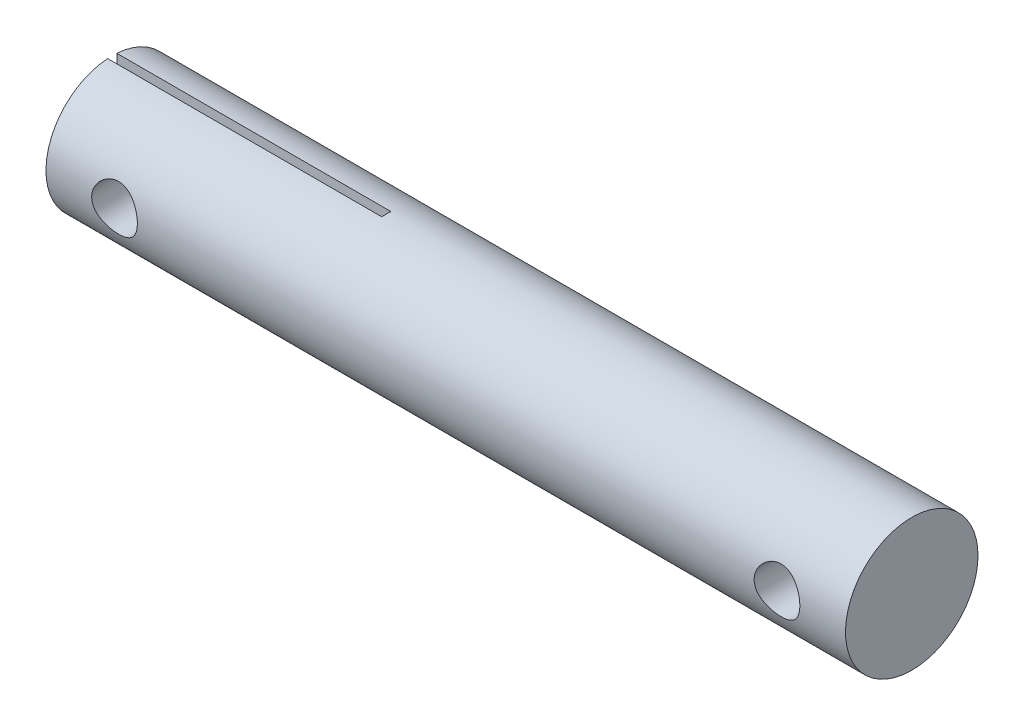
ISO-10303-21;
HEADER;
FILE_DESCRIPTION(('STEP AP214'),'2;1');
FILE_NAME('part.step','',(''),(''),'','','');
FILE_SCHEMA(('AUTOMOTIVE_DESIGN { 1 0 10303 214 1 1 1 1 }'));
ENDSEC;
DATA;
#1=APPLICATION_CONTEXT('core data for automotive mechanical design processes');
#2=APPLICATION_PROTOCOL_DEFINITION('international standard','automotive_design',2000,#1);
#3=PRODUCT_CONTEXT('',#1,'mechanical');
#4=PRODUCT('Part','Part','',(#3));
#5=PRODUCT_RELATED_PRODUCT_CATEGORY('part','',(#4));
#6=PRODUCT_DEFINITION_FORMATION('','',#4);
#7=PRODUCT_DEFINITION_CONTEXT('part definition',#1,'design');
#8=PRODUCT_DEFINITION('design','',#6,#7);
#9=PRODUCT_DEFINITION_SHAPE('','',#8);
#10=(LENGTH_UNIT() NAMED_UNIT(*) SI_UNIT(.MILLI.,.METRE.));
#11=(NAMED_UNIT(*) PLANE_ANGLE_UNIT() SI_UNIT($,.RADIAN.));
#12=(NAMED_UNIT(*) SI_UNIT($,.STERADIAN.) SOLID_ANGLE_UNIT());
#13=UNCERTAINTY_MEASURE_WITH_UNIT(LENGTH_MEASURE(1.E-05),#10,'distance_accuracy_value','');
#14=(GEOMETRIC_REPRESENTATION_CONTEXT(3) GLOBAL_UNCERTAINTY_ASSIGNED_CONTEXT((#13)) GLOBAL_UNIT_ASSIGNED_CONTEXT((#10,
#11,#12)) REPRESENTATION_CONTEXT('',''));
#15=CARTESIAN_POINT('',(0.,0.,0.));
#16=DIRECTION('',(0.,0.,1.));
#17=DIRECTION('',(1.,0.,0.));
#18=AXIS2_PLACEMENT_3D('',#15,#16,#17);
#19=CARTESIAN_POINT('',(35.,0.,0.));
#20=DIRECTION('',(-1.,0.,0.));
#21=DIRECTION('',(0.,0.,1.));
#22=AXIS2_PLACEMENT_3D('',#19,#20,#21);
#23=CYLINDRICAL_SURFACE('',#22,2.9);
#24=CARTESIAN_POINT('',(0.,0.,0.));
#25=DIRECTION('',(1.,0.,0.));
#26=DIRECTION('',(0.,0.,-1.));
#27=AXIS2_PLACEMENT_3D('',#24,#25,#26);
#28=CIRCLE('',#27,2.9);
#29=CARTESIAN_POINT('',(0.,2.89309522829789,0.2));
#30=VERTEX_POINT('',#29);
#31=CARTESIAN_POINT('',(0.,2.89309522829789,-0.2));
#32=VERTEX_POINT('',#31);
#33=EDGE_CURVE('E111',#30,#32,#28,.T.);
#34=ORIENTED_EDGE('',*,*,#33,.T.);
#35=DIRECTION('',(-1.,0.,0.));
#36=VECTOR('',#35,1.);
#37=CARTESIAN_POINT('',(35.,2.89309522829789,-0.2));
#38=LINE('',#37,#36);
#39=CARTESIAN_POINT('',(12.,2.89309522829789,-0.2));
#40=VERTEX_POINT('',#39);
#41=EDGE_CURVE('E109',#32,#40,#38,.F.);
#42=ORIENTED_EDGE('',*,*,#41,.T.);
#43=CARTESIAN_POINT('',(12.,0.,0.));
#44=DIRECTION('',(-1.,0.,0.));
#45=DIRECTION('',(0.,0.,1.));
#46=AXIS2_PLACEMENT_3D('',#43,#44,#45);
#47=CIRCLE('',#46,2.9);
#48=CARTESIAN_POINT('',(12.,2.89309522829789,0.2));
#49=VERTEX_POINT('',#48);
#50=EDGE_CURVE('E11',#49,#40,#47,.T.);
#51=ORIENTED_EDGE('',*,*,#50,.F.);
#52=DIRECTION('',(-1.,0.,0.));
#53=VECTOR('',#52,1.);
#54=CARTESIAN_POINT('',(35.,2.89309522829789,0.2));
#55=LINE('',#54,#53);
#56=EDGE_CURVE('E105',#49,#30,#55,.T.);
#57=ORIENTED_EDGE('',*,*,#56,.T.);
#58=EDGE_LOOP('',(#34,#42,#51,#57));
#59=FACE_BOUND('',#58,.T.);
#60=CARTESIAN_POINT('',(35.,0.,0.));
#61=DIRECTION('',(1.,0.,0.));
#62=DIRECTION('',(0.,0.,-1.));
#63=AXIS2_PLACEMENT_3D('',#60,#61,#62);
#64=CIRCLE('',#63,2.9);
#65=CARTESIAN_POINT('',(35.,0.,-2.9));
#66=VERTEX_POINT('',#65);
#67=EDGE_CURVE('E112',#66,#66,#64,.T.);
#68=ORIENTED_EDGE('',*,*,#67,.F.);
#69=EDGE_LOOP('',(#68));
#70=FACE_BOUND('',#69,.T.);
#71=CARTESIAN_POINT('',(32.,-1.00345238585106,-2.72086076625207));
#72=CARTESIAN_POINT('',(31.945668932359,-1.00345305999284,-2.72086021317153));
#73=CARTESIAN_POINT('',(31.8913425304579,-0.99900963956225,-2.72251153528407));
#74=CARTESIAN_POINT('',(31.7843073470255,-0.981419137113376,-2.72890129793882));
#75=CARTESIAN_POINT('',(31.7315987427294,-0.968271105011568,-2.73364007546708));
#76=CARTESIAN_POINT('',(31.6293691768065,-0.93379540289949,-2.74560649818595));
#77=CARTESIAN_POINT('',(31.5798418181211,-0.912484788995946,-2.75282895042417));
#78=CARTESIAN_POINT('',(31.4850485391322,-0.862348136474107,-2.76894323666809));
#79=CARTESIAN_POINT('',(31.4397836653777,-0.833520258689757,-2.77783547905372));
#80=CARTESIAN_POINT('',(31.3528910509856,-0.767865567456136,-2.79671067974953));
#81=CARTESIAN_POINT('',(31.3114690637809,-0.730774639190834,-2.80672237157249));
#82=CARTESIAN_POINT('',(31.2352915572014,-0.650209936416537,-2.82647224615793));
#83=CARTESIAN_POINT('',(31.2005372108595,-0.606735041151965,-2.83621038053691));
#84=CARTESIAN_POINT('',(31.1377241490165,-0.513105991243305,-2.8546557797525));
#85=CARTESIAN_POINT('',(31.1098848849623,-0.462796598211762,-2.86332568248111));
#86=CARTESIAN_POINT('',(31.0631473899614,-0.357858093927535,-2.87832267666306));
#87=CARTESIAN_POINT('',(31.044246576938,-0.303230235491408,-2.8846504445809));
#88=CARTESIAN_POINT('',(31.0166233804261,-0.193347112050211,-2.8940531545862));
#89=CARTESIAN_POINT('',(31.0075506312218,-0.13818965474278,-2.8972396740321));
#90=CARTESIAN_POINT('',(30.9987266279835,-0.0270490486292474,-2.9004060699528));
#91=CARTESIAN_POINT('',(30.9989727854618,0.0289338665728227,-2.90038683687585));
#92=CARTESIAN_POINT('',(31.0085625239348,0.13762558202393,-2.89722155986127));
#93=CARTESIAN_POINT('',(31.0175215551512,0.190372821437222,-2.89420757026013));
#94=CARTESIAN_POINT('',(31.0436454923048,0.293565337173212,-2.88556784571808));
#95=CARTESIAN_POINT('',(31.0608109506516,0.34401045828003,-2.87994193495832));
#96=CARTESIAN_POINT('',(31.1030638037487,0.441955880220831,-2.86655764298503));
#97=CARTESIAN_POINT('',(31.1282530340935,0.489408372673723,-2.85877202516899));
#98=CARTESIAN_POINT('',(31.1857528086158,0.579523136222241,-2.84187578287272));
#99=CARTESIAN_POINT('',(31.2180654169426,0.622184013426221,-2.83276477459341));
#100=CARTESIAN_POINT('',(31.2907892251231,0.703762509714336,-2.81363851749344));
#101=CARTESIAN_POINT('',(31.3315245519862,0.742386348329864,-2.80360083413692));
#102=CARTESIAN_POINT('',(31.4189710079291,0.81235501606704,-2.7841338849641));
#103=CARTESIAN_POINT('',(31.4656831967856,0.843698551512894,-2.77470472749465));
#104=CARTESIAN_POINT('',(31.5647592401226,0.898670505204048,-2.75739707918534));
#105=CARTESIAN_POINT('',(31.6172031288642,0.922164154932909,-2.74954651501986));
#106=CARTESIAN_POINT('',(31.7256409113218,0.959884764577872,-2.73660804649032));
#107=CARTESIAN_POINT('',(31.7816331940916,0.974115897005449,-2.73151889835572));
#108=CARTESIAN_POINT('',(31.8927329312364,0.992293807321215,-2.72496651191048));
#109=CARTESIAN_POINT('',(31.9477562983551,0.996696547696072,-2.72334267843518));
#110=CARTESIAN_POINT('',(32.0577679839026,0.996391051294899,-2.72345471292078));
#111=CARTESIAN_POINT('',(32.1127563071081,0.991684614395714,-2.72518991717145));
#112=CARTESIAN_POINT('',(32.2189869483547,0.973706350635807,-2.73166254207127));
#113=CARTESIAN_POINT('',(32.2702924338232,0.960761879390611,-2.7362851027711));
#114=CARTESIAN_POINT('',(32.3699899499211,0.927073032755896,-2.7478811371546));
#115=CARTESIAN_POINT('',(32.4183814415743,0.90632721952944,-2.75485504418183));
#116=CARTESIAN_POINT('',(32.5126560120335,0.856844928483978,-2.77065167629178));
#117=CARTESIAN_POINT('',(32.558402842708,0.827866455685997,-2.77952800547223));
#118=CARTESIAN_POINT('',(32.6445495608127,0.763010208204303,-2.79802624699304));
#119=CARTESIAN_POINT('',(32.6849477695597,0.727130276099429,-2.80764839191506));
#120=CARTESIAN_POINT('',(32.7614090763962,0.647290220975024,-2.82715171540382));
#121=CARTESIAN_POINT('',(32.797140499569,0.603008476243459,-2.83702060425689));
#122=CARTESIAN_POINT('',(32.8606915134477,0.508832932689618,-2.85541373280247));
#123=CARTESIAN_POINT('',(32.8885113395954,0.458939300933455,-2.86393801250591));
#124=CARTESIAN_POINT('',(32.9352022099163,0.355172999359483,-2.87864166119301));
#125=CARTESIAN_POINT('',(32.9541280723282,0.301327134155518,-2.88483534639934));
#126=CARTESIAN_POINT('',(32.9825720117828,0.190960227968754,-2.89423492121065));
#127=CARTESIAN_POINT('',(32.9920937399522,0.134440234146482,-2.89744197034039));
#128=CARTESIAN_POINT('',(33.001114241551,0.0233667148665718,-2.90041149574827));
#129=CARTESIAN_POINT('',(33.0010896475362,-0.0311441224823618,-2.90033793823468));
#130=CARTESIAN_POINT('',(32.9922090935117,-0.139345884020661,-2.89715575799774));
#131=CARTESIAN_POINT('',(32.9833539197338,-0.193036880772543,-2.89404740547828));
#132=CARTESIAN_POINT('',(32.9573834204143,-0.297127069654994,-2.88520341500109));
#133=CARTESIAN_POINT('',(32.9404166532676,-0.347567637508001,-2.87951511954888));
#134=CARTESIAN_POINT('',(32.8988467648995,-0.444900676590368,-2.86609137345669));
#135=CARTESIAN_POINT('',(32.8742422244528,-0.491792486385586,-2.8583555423899));
#136=CARTESIAN_POINT('',(32.8170001214792,-0.582681258921846,-2.84125053015508));
#137=CARTESIAN_POINT('',(32.7840880832711,-0.626495484694053,-2.83182964865602));
#138=CARTESIAN_POINT('',(32.7116225365943,-0.708132805944206,-2.81252747399333));
#139=CARTESIAN_POINT('',(32.6720668261353,-0.745953906946411,-2.80264602896683));
#140=CARTESIAN_POINT('',(32.585417997114,-0.816179871818549,-2.78302676539399));
#141=CARTESIAN_POINT('',(32.5380750419355,-0.848284273074713,-2.77331312276287));
#142=CARTESIAN_POINT('',(32.4383578487793,-0.904065659755598,-2.75563521416128));
#143=CARTESIAN_POINT('',(32.3859844955296,-0.927744123669304,-2.74767064137764));
#144=CARTESIAN_POINT('',(32.2788460164568,-0.965427356382385,-2.7346556717468));
#145=CARTESIAN_POINT('',(32.2241606689957,-0.979636796504087,-2.72954403479918));
#146=CARTESIAN_POINT('',(32.1129813570893,-0.998646999275911,-2.72264756313134));
#147=CARTESIAN_POINT('',(32.056488156755,-1.00345168494404,-2.72086134129139));
#148=CARTESIAN_POINT('',(32.,-1.00345238585106,-2.72086076625207));
#149=B_SPLINE_CURVE_WITH_KNOTS('',3,(#71,#72,#73,#74,#75,#76,#77,#78,#79,#80,#81,#82,#83,#84,
#85,#86,#87,#88,#89,#90,#91,#92,#93,#94,#95,#96,#97,#98,#99,#100,#101,#102,#103,#104,#105,#106,
#107,#108,#109,#110,#111,#112,#113,#114,#115,#116,#117,#118,#119,#120,#121,#122,#123,#124,#125,
#126,#127,#128,#129,#130,#131,#132,#133,#134,#135,#136,#137,#138,#139,#140,#141,#142,#143,#144,
#145,#146,#147,#148),.UNSPECIFIED.,.T.,.F.,(4,2,2,2,2,2,2,2,2,2,2,2,2,2,2,2,2,2,2,2,2,2,2,2,2,2,
2,2,2,2,2,2,2,2,2,2,2,2,4),(0.,0.162783640432791,0.32558505116519,0.488048120137136,
0.650550974510748,0.819278892298356,0.988036467090618,1.1616113480098,1.33513605716309,
1.50224748559135,1.66931249626559,1.82932369651847,1.98934566932663,2.15148543774813,
2.31367225149578,2.48396770465967,2.65429339541776,2.82740873434802,3.00044603546556,
3.16527249789327,3.33006639568444,3.48868911362301,3.64734108107733,3.81125002275815,
3.97521028648539,4.14763900612138,4.32006259390509,4.49140903416606,4.66268892350997,
4.82541824017966,4.98813306951629,5.14797582779596,5.30784830531739,5.47391952994901,
5.64004590653314,5.81327030678005,5.98646429654651,6.15578152671846,6.32502811430031),.UNSPECIFIED.);
#150=CARTESIAN_POINT('',(32.,-1.00345238585106,-2.72086076625207));
#151=VERTEX_POINT('',#150);
#152=EDGE_CURVE('E121',#151,#151,#149,.T.);
#153=ORIENTED_EDGE('',*,*,#152,.F.);
#154=EDGE_LOOP('',(#153));
#155=FACE_BOUND('',#154,.T.);
#156=CARTESIAN_POINT('',(32.9999940404982,0.,2.9));
#157=CARTESIAN_POINT('',(32.9998066534307,0.0544645815206822,2.90000044547209));
#158=CARTESIAN_POINT('',(32.9951540273774,0.108909158166563,2.89845171840446));
#159=CARTESIAN_POINT('',(32.9771022915649,0.216157473174875,2.89243177943249));
#160=CARTESIAN_POINT('',(32.9637028451294,0.268961148294963,2.88796045503368));
#161=CARTESIAN_POINT('',(32.9286738510098,0.371366993483789,2.87658461533888));
#162=CARTESIAN_POINT('',(32.9070586724938,0.420974577301274,2.86968434976551));
#163=CARTESIAN_POINT('',(32.8562767609551,0.515862220429735,2.85415499250082));
#164=CARTESIAN_POINT('',(32.8271083835114,0.561141334438723,2.84552552443424));
#165=CARTESIAN_POINT('',(32.7609226261194,0.6477502051607,2.82709145927908));
#166=CARTESIAN_POINT('',(32.7236771707835,0.688899359123849,2.81725739643333));
#167=CARTESIAN_POINT('',(32.6428854967667,0.764506273208072,2.79768802354975));
#168=CARTESIAN_POINT('',(32.5993377858124,0.798962443999024,2.78795273748656));
#169=CARTESIAN_POINT('',(32.505543985335,0.861237782008968,2.76936103341232));
#170=CARTESIAN_POINT('',(32.4551335122686,0.888821182355332,2.76054069383681));
#171=CARTESIAN_POINT('',(32.3500356479676,0.935039630398494,2.74523188932798));
#172=CARTESIAN_POINT('',(32.2953496859037,0.953677653526569,2.73874264920008));
#173=CARTESIAN_POINT('',(32.1853235578271,0.980797899806466,2.72914583302455));
#174=CARTESIAN_POINT('',(32.1300776488503,0.989621255546707,2.72592503337929));
#175=CARTESIAN_POINT('',(32.0188030109952,0.997924912373515,2.72289687865501));
#176=CARTESIAN_POINT('',(31.9627745443853,0.997408272016872,2.72308840614522));
#177=CARTESIAN_POINT('',(31.8544191705704,0.98731668940651,2.72676179672425));
#178=CARTESIAN_POINT('',(31.8020447524896,0.978183450876784,2.73008320631409));
#179=CARTESIAN_POINT('',(31.6996214351159,0.951832893957073,2.73938083645186));
#180=CARTESIAN_POINT('',(31.6495728392984,0.93461452384829,2.74535740237868));
#181=CARTESIAN_POINT('',(31.5521959949833,0.892282191854265,2.75940857278499));
#182=CARTESIAN_POINT('',(31.5049310798549,0.867034678862539,2.76751823130883));
#183=CARTESIAN_POINT('',(31.4151687197975,0.809454608585571,2.78490319254488));
#184=CARTESIAN_POINT('',(31.3726727322301,0.777119894351839,2.79417884975467));
#185=CARTESIAN_POINT('',(31.2911690999109,0.704158799925792,2.8134781728678));
#186=CARTESIAN_POINT('',(31.2524872607743,0.663171085198727,2.8235147369521));
#187=CARTESIAN_POINT('',(31.1824612227271,0.575160566726665,2.8427481160544));
#188=CARTESIAN_POINT('',(31.1511177678669,0.528137151760102,2.85194484586265));
#189=CARTESIAN_POINT('',(31.0964071278608,0.428717022858946,2.86858225182407));
#190=CARTESIAN_POINT('',(31.0731242510466,0.376270552797057,2.87600412946802));
#191=CARTESIAN_POINT('',(31.035813417151,0.26788785173058,2.88811418602225));
#192=CARTESIAN_POINT('',(31.0217819945176,0.211952936085916,2.8928033885035));
#193=CARTESIAN_POINT('',(31.003952897255,0.100961462789689,2.89875006472955));
#194=CARTESIAN_POINT('',(30.9997117901351,0.0459839946263809,2.9001562709705));
#195=CARTESIAN_POINT('',(31.0003185506263,-0.0639052332866257,2.89981604187808));
#196=CARTESIAN_POINT('',(31.0051648190918,-0.118817002896071,2.89807016123339));
#197=CARTESIAN_POINT('',(31.0234621762833,-0.225268981602776,2.89171457884867));
#198=CARTESIAN_POINT('',(31.0366460923986,-0.276860942125068,2.88719392029373));
#199=CARTESIAN_POINT('',(31.0709085491309,-0.377075950510625,2.87582321844246));
#200=CARTESIAN_POINT('',(31.0919881389462,-0.42569860280517,2.86897286558128));
#201=CARTESIAN_POINT('',(31.1421004898323,-0.520120040805736,2.85338931812693));
#202=CARTESIAN_POINT('',(31.1713404581055,-0.565800780840769,2.84460854341361));
#203=CARTESIAN_POINT('',(31.2366983655992,-0.651748288075916,2.82615633153855));
#204=CARTESIAN_POINT('',(31.2728185483872,-0.692013281929065,2.81648460437907));
#205=CARTESIAN_POINT('',(31.3529909816864,-0.768028568002402,2.79673919728646));
#206=CARTESIAN_POINT('',(31.3973438862432,-0.803463444220475,2.78666888404577));
#207=CARTESIAN_POINT('',(31.4915873227375,-0.866428441564638,2.7677402735469));
#208=CARTESIAN_POINT('',(31.5414779477942,-0.893958429738783,2.75888199667523));
#209=CARTESIAN_POINT('',(31.6454318169645,-0.940207758493913,2.7434660823836));
#210=CARTESIAN_POINT('',(31.6994877009546,-0.958942243405091,2.73690449545739));
#211=CARTESIAN_POINT('',(31.8102691618955,-0.98694722910158,2.72693244905969));
#212=CARTESIAN_POINT('',(31.8669933976262,-0.996222432433083,2.72352042390886));
#213=CARTESIAN_POINT('',(31.9781149136589,-1.0046779545737,2.72041177966843));
#214=CARTESIAN_POINT('',(32.0324667549055,-1.00438965020842,2.72051958296488));
#215=CARTESIAN_POINT('',(32.1403016547198,-0.995038917259364,2.72395333951936));
#216=CARTESIAN_POINT('',(32.1937847673116,-0.985977036420875,2.72727909187683));
#217=CARTESIAN_POINT('',(32.2972387928766,-0.959715262773382,2.73662809198885));
#218=CARTESIAN_POINT('',(32.347259989615,-0.942691032115902,2.7425929700232));
#219=CARTESIAN_POINT('',(32.4437750227589,-0.901130615751719,2.75652711698348));
#220=CARTESIAN_POINT('',(32.4902680309059,-0.876592672931815,2.76449685467639));
#221=CARTESIAN_POINT('',(32.5807694389694,-0.81936057432578,2.78201053480927));
#222=CARTESIAN_POINT('',(32.6245591665344,-0.786337970636084,2.79161076236934));
#223=CARTESIAN_POINT('',(32.706145443988,-0.713625822124459,2.81107686227833));
#224=CARTESIAN_POINT('',(32.7439402344713,-0.673934327115974,2.82094281162167));
#225=CARTESIAN_POINT('',(32.8140938419515,-0.58697807802039,2.84033823368347));
#226=CARTESIAN_POINT('',(32.8461516801831,-0.539462338137373,2.84983535691801));
#227=CARTESIAN_POINT('',(32.9017928586473,-0.439394021766618,2.86696796562436));
#228=CARTESIAN_POINT('',(32.9253777064506,-0.386842343416352,2.8746037821944));
#229=CARTESIAN_POINT('',(32.9628203541613,-0.279387678342412,2.8870052949059));
#230=CARTESIAN_POINT('',(32.976884305494,-0.224563783257892,2.89183147940451));
#231=CARTESIAN_POINT('',(32.99556692245,-0.113152346944582,2.89832808821211));
#232=CARTESIAN_POINT('',(33.0001886554431,-0.0565653845270845,2.8999995373452));
#233=CARTESIAN_POINT('',(32.9999940404982,0.,2.9));
#234=B_SPLINE_CURVE_WITH_KNOTS('',3,(#156,#157,#158,#159,#160,#161,#162,#163,#164,#165,#166,
#167,#168,#169,#170,#171,#172,#173,#174,#175,#176,#177,#178,#179,#180,#181,#182,#183,#184,#185,
#186,#187,#188,#189,#190,#191,#192,#193,#194,#195,#196,#197,#198,#199,#200,#201,#202,#203,#204,
#205,#206,#207,#208,#209,#210,#211,#212,#213,#214,#215,#216,#217,#218,#219,#220,#221,#222,#223,
#224,#225,#226,#227,#228,#229,#230,#231,#232,#233),.UNSPECIFIED.,.T.,.F.,(4,2,2,2,2,2,2,2,2,2,2,
2,2,2,2,2,2,2,2,2,2,2,2,2,2,2,2,2,2,2,2,2,2,2,2,2,2,2,4),(0.,0.163186329623233,
0.326378940865445,0.489287434816883,0.652231425742869,0.820575212375441,0.988958925545895,
1.16250309549465,1.33598950072153,1.50323671978019,1.67042917159445,1.82949148194305,
1.98857448894733,2.15045566021257,2.31238616765092,2.48332953743942,2.6542902319502,
2.82698856165705,2.99962216255689,3.16426883704889,3.32888654065695,3.48847938434288,
3.64809344267939,3.812201329649,3.97636282241749,4.14852002962219,4.32068013216137,
4.49254270776626,4.66431980264654,4.82656931927433,4.98880870711639,5.14762644984913,
5.30648136118026,5.47278373043323,5.63913481646782,5.81258816901449,5.98601064428797,
6.15554646618414,6.32502720443596),.UNSPECIFIED.);
#235=CARTESIAN_POINT('',(32.9999940404982,0.,2.9));
#236=VERTEX_POINT('',#235);
#237=EDGE_CURVE('E41',#236,#236,#234,.T.);
#238=ORIENTED_EDGE('',*,*,#237,.F.);
#239=EDGE_LOOP('',(#238));
#240=FACE_BOUND('',#239,.T.);
#241=CARTESIAN_POINT('',(3.,-1.00345238585106,-2.72086076625207));
#242=CARTESIAN_POINT('',(2.94566893235899,-1.00345305999284,-2.72086021317153));
#243=CARTESIAN_POINT('',(2.89134253045788,-0.999009639562248,-2.72251153528407));
#244=CARTESIAN_POINT('',(2.7843073470255,-0.981419137113374,-2.72890129793882));
#245=CARTESIAN_POINT('',(2.7315987427294,-0.968271105011566,-2.73364007546708));
#246=CARTESIAN_POINT('',(2.62936917680646,-0.933795402899488,-2.74560649818595));
#247=CARTESIAN_POINT('',(2.57984181812114,-0.912484788995944,-2.75282895042417));
#248=CARTESIAN_POINT('',(2.48504853913221,-0.862348136474104,-2.76894323666809));
#249=CARTESIAN_POINT('',(2.43978366537773,-0.833520258689754,-2.77783547905372));
#250=CARTESIAN_POINT('',(2.35289105098564,-0.767865567456131,-2.79671067974953));
#251=CARTESIAN_POINT('',(2.31146906378093,-0.730774639190829,-2.80672237157249));
#252=CARTESIAN_POINT('',(2.23529155720145,-0.650209936416532,-2.82647224615793));
#253=CARTESIAN_POINT('',(2.20053721085951,-0.606735041151961,-2.83621038053691));
#254=CARTESIAN_POINT('',(2.1377241490165,-0.513105991243302,-2.8546557797525));
#255=CARTESIAN_POINT('',(2.10988488496225,-0.462796598211759,-2.86332568248111));
#256=CARTESIAN_POINT('',(2.06314738996144,-0.357858093927532,-2.87832267666306));
#257=CARTESIAN_POINT('',(2.04424657693797,-0.303230235491405,-2.8846504445809));
#258=CARTESIAN_POINT('',(2.01662338042609,-0.193347112050209,-2.8940531545862));
#259=CARTESIAN_POINT('',(2.00755063122176,-0.138189654742778,-2.8972396740321));
#260=CARTESIAN_POINT('',(1.9987266279835,-0.027049048629246,-2.9004060699528));
#261=CARTESIAN_POINT('',(1.99897278546178,0.0289338665728237,-2.90038683687585));
#262=CARTESIAN_POINT('',(2.00856252393479,0.137625582023931,-2.89722155986127));
#263=CARTESIAN_POINT('',(2.01752155515124,0.190372821437223,-2.89420757026013));
#264=CARTESIAN_POINT('',(2.04364549230479,0.293565337173213,-2.88556784571808));
#265=CARTESIAN_POINT('',(2.0608109506516,0.344010458280031,-2.87994193495832));
#266=CARTESIAN_POINT('',(2.10306380374873,0.441955880220833,-2.86655764298503));
#267=CARTESIAN_POINT('',(2.12825303409353,0.489408372673726,-2.85877202516899));
#268=CARTESIAN_POINT('',(2.18575280861581,0.579523136222244,-2.84187578287272));
#269=CARTESIAN_POINT('',(2.21806541694259,0.622184013426224,-2.83276477459341));
#270=CARTESIAN_POINT('',(2.29078922512315,0.703762509714338,-2.81363851749344));
#271=CARTESIAN_POINT('',(2.33152455198626,0.742386348329868,-2.80360083413691));
#272=CARTESIAN_POINT('',(2.41897100792909,0.812355016067043,-2.7841338849641));
#273=CARTESIAN_POINT('',(2.46568319678563,0.843698551512895,-2.77470472749465));
#274=CARTESIAN_POINT('',(2.56475924012264,0.898670505204048,-2.75739707918534));
#275=CARTESIAN_POINT('',(2.61720312886419,0.922164154932908,-2.74954651501986));
#276=CARTESIAN_POINT('',(2.7256409113218,0.959884764577871,-2.73660804649032));
#277=CARTESIAN_POINT('',(2.7816331940916,0.974115897005448,-2.73151889835572));
#278=CARTESIAN_POINT('',(2.89273293123637,0.992293807321214,-2.72496651191048));
#279=CARTESIAN_POINT('',(2.94775629835506,0.996696547696071,-2.72334267843518));
#280=CARTESIAN_POINT('',(3.05776798390255,0.996391051294897,-2.72345471292078));
#281=CARTESIAN_POINT('',(3.11275630710812,0.991684614395713,-2.72518991717145));
#282=CARTESIAN_POINT('',(3.21898694835471,0.973706350635806,-2.73166254207127));
#283=CARTESIAN_POINT('',(3.27029243382318,0.96076187939061,-2.7362851027711));
#284=CARTESIAN_POINT('',(3.36998994992106,0.927073032755894,-2.7478811371546));
#285=CARTESIAN_POINT('',(3.41838144157433,0.906327219529437,-2.75485504418184));
#286=CARTESIAN_POINT('',(3.51265601203353,0.856844928483975,-2.77065167629178));
#287=CARTESIAN_POINT('',(3.55840284270796,0.827866455685994,-2.77952800547223));
#288=CARTESIAN_POINT('',(3.64454956081268,0.763010208204302,-2.79802624699304));
#289=CARTESIAN_POINT('',(3.68494776955967,0.72713027609943,-2.80764839191506));
#290=CARTESIAN_POINT('',(3.76140907639617,0.647290220975024,-2.82715171540382));
#291=CARTESIAN_POINT('',(3.79714049956896,0.603008476243458,-2.83702060425689));
#292=CARTESIAN_POINT('',(3.86069151344774,0.508832932689615,-2.85541373280247));
#293=CARTESIAN_POINT('',(3.88851133959538,0.458939300933451,-2.86393801250591));
#294=CARTESIAN_POINT('',(3.93520220991634,0.355172999359479,-2.87864166119301));
#295=CARTESIAN_POINT('',(3.95412807232818,0.301327134155515,-2.88483534639934));
#296=CARTESIAN_POINT('',(3.98257201178281,0.190960227968752,-2.89423492121065));
#297=CARTESIAN_POINT('',(3.99209373995218,0.134440234146481,-2.89744197034039));
#298=CARTESIAN_POINT('',(4.00111424155103,0.0233667148665714,-2.90041149574827));
#299=CARTESIAN_POINT('',(4.0010896475362,-0.0311441224823622,-2.90033793823468));
#300=CARTESIAN_POINT('',(3.99220909351165,-0.139345884020662,-2.89715575799774));
#301=CARTESIAN_POINT('',(3.98335391973378,-0.193036880772544,-2.89404740547828));
#302=CARTESIAN_POINT('',(3.95738342041427,-0.297127069654995,-2.88520341500109));
#303=CARTESIAN_POINT('',(3.94041665326756,-0.347567637508001,-2.87951511954888));
#304=CARTESIAN_POINT('',(3.8988467648995,-0.444900676590368,-2.86609137345669));
#305=CARTESIAN_POINT('',(3.87424222445277,-0.491792486385586,-2.8583555423899));
#306=CARTESIAN_POINT('',(3.81700012147922,-0.582681258921847,-2.84125053015508));
#307=CARTESIAN_POINT('',(3.78408808327106,-0.626495484694052,-2.83182964865602));
#308=CARTESIAN_POINT('',(3.71162253659431,-0.708132805944205,-2.81252747399333));
#309=CARTESIAN_POINT('',(3.67206682613533,-0.745953906946411,-2.80264602896683));
#310=CARTESIAN_POINT('',(3.585417997114,-0.816179871818548,-2.78302676539399));
#311=CARTESIAN_POINT('',(3.53807504193548,-0.848284273074711,-2.77331312276287));
#312=CARTESIAN_POINT('',(3.43835784877927,-0.904065659755595,-2.75563521416128));
#313=CARTESIAN_POINT('',(3.38598449552958,-0.927744123669301,-2.74767064137764));
#314=CARTESIAN_POINT('',(3.27884601645684,-0.965427356382383,-2.7346556717468));
#315=CARTESIAN_POINT('',(3.22416066899574,-0.979636796504084,-2.72954403479919));
#316=CARTESIAN_POINT('',(3.11298135708933,-0.998646999275909,-2.72264756313134));
#317=CARTESIAN_POINT('',(3.05648815675502,-1.00345168494404,-2.72086134129139));
#318=CARTESIAN_POINT('',(3.,-1.00345238585106,-2.72086076625207));
#319=B_SPLINE_CURVE_WITH_KNOTS('',3,(#241,#242,#243,#244,#245,#246,#247,#248,#249,#250,#251,
#252,#253,#254,#255,#256,#257,#258,#259,#260,#261,#262,#263,#264,#265,#266,#267,#268,#269,#270,
#271,#272,#273,#274,#275,#276,#277,#278,#279,#280,#281,#282,#283,#284,#285,#286,#287,#288,#289,
#290,#291,#292,#293,#294,#295,#296,#297,#298,#299,#300,#301,#302,#303,#304,#305,#306,#307,#308,
#309,#310,#311,#312,#313,#314,#315,#316,#317,#318),.UNSPECIFIED.,.T.,.F.,(4,2,2,2,2,2,2,2,2,2,2,
2,2,2,2,2,2,2,2,2,2,2,2,2,2,2,2,2,2,2,2,2,2,2,2,2,2,2,4),(0.,0.162783640432791,
0.325585051165192,0.48804812013714,0.650550974510754,0.819278892298359,0.98803646709062,
1.1616113480098,1.33513605716309,1.50224748559135,1.66931249626558,1.82932369651846,
1.98934566932663,2.15148543774814,2.31367225149579,2.48396770465968,2.65429339541776,
2.82740873434802,3.00044603546556,3.16527249789327,3.33006639568443,3.48868911362301,
3.64734108107733,3.81125002275815,3.97521028648539,4.14763900612138,4.32006259390509,
4.49140903416606,4.66268892350996,4.82541824017965,4.98813306951628,5.14797582779595,
5.30784830531738,5.47391952994901,5.64004590653313,5.81327030678004,5.9864642965465,
6.15578152671844,6.3250281143003),.UNSPECIFIED.);
#320=CARTESIAN_POINT('',(3.,-1.00345238585106,-2.72086076625207));
#321=VERTEX_POINT('',#320);
#322=EDGE_CURVE('E172',#321,#321,#319,.T.);
#323=ORIENTED_EDGE('',*,*,#322,.F.);
#324=EDGE_LOOP('',(#323));
#325=FACE_BOUND('',#324,.T.);
#326=CARTESIAN_POINT('',(3.99999404049821,0.,2.9));
#327=CARTESIAN_POINT('',(3.99980665343065,0.054464581520682,2.90000044547209));
#328=CARTESIAN_POINT('',(3.99515402737745,0.108909158166563,2.89845171840446));
#329=CARTESIAN_POINT('',(3.97710229156492,0.216157473174874,2.89243177943249));
#330=CARTESIAN_POINT('',(3.9637028451294,0.268961148294962,2.88796045503368));
#331=CARTESIAN_POINT('',(3.92867385100979,0.371366993483788,2.87658461533888));
#332=CARTESIAN_POINT('',(3.90705867249376,0.420974577301274,2.86968434976551));
#333=CARTESIAN_POINT('',(3.8562767609551,0.515862220429733,2.85415499250082));
#334=CARTESIAN_POINT('',(3.82710838351144,0.56114133443872,2.84552552443424));
#335=CARTESIAN_POINT('',(3.76092262611943,0.647750205160698,2.82709145927908));
#336=CARTESIAN_POINT('',(3.72367717078349,0.688899359123849,2.81725739643333));
#337=CARTESIAN_POINT('',(3.6428854967667,0.764506273208073,2.79768802354975));
#338=CARTESIAN_POINT('',(3.59933778581236,0.798962443999024,2.78795273748656));
#339=CARTESIAN_POINT('',(3.50554398533497,0.861237782008968,2.76936103341232));
#340=CARTESIAN_POINT('',(3.45513351226858,0.888821182355332,2.76054069383681));
#341=CARTESIAN_POINT('',(3.3500356479676,0.935039630398493,2.74523188932798));
#342=CARTESIAN_POINT('',(3.2953496859037,0.953677653526569,2.73874264920008));
#343=CARTESIAN_POINT('',(3.18532355782714,0.980797899806465,2.72914583302455));
#344=CARTESIAN_POINT('',(3.13007764885033,0.989621255546706,2.72592503337929));
#345=CARTESIAN_POINT('',(3.01880301099517,0.997924912373514,2.72289687865501));
#346=CARTESIAN_POINT('',(2.96277454438534,0.997408272016872,2.72308840614522));
#347=CARTESIAN_POINT('',(2.85441917057035,0.987316689406509,2.72676179672425));
#348=CARTESIAN_POINT('',(2.80204475248956,0.978183450876782,2.73008320631409));
#349=CARTESIAN_POINT('',(2.69962143511588,0.951832893957071,2.73938083645186));
#350=CARTESIAN_POINT('',(2.64957283929843,0.93461452384829,2.74535740237868));
#351=CARTESIAN_POINT('',(2.55219599498333,0.892282191854265,2.75940857278499));
#352=CARTESIAN_POINT('',(2.50493107985492,0.867034678862537,2.76751823130884));
#353=CARTESIAN_POINT('',(2.41516871979746,0.80945460858557,2.78490319254488));
#354=CARTESIAN_POINT('',(2.37267273223009,0.777119894351839,2.79417884975467));
#355=CARTESIAN_POINT('',(2.29116909991086,0.704158799925793,2.8134781728678));
#356=CARTESIAN_POINT('',(2.25248726077434,0.663171085198727,2.8235147369521));
#357=CARTESIAN_POINT('',(2.18246122272713,0.575160566726664,2.8427481160544));
#358=CARTESIAN_POINT('',(2.15111776786691,0.528137151760101,2.85194484586265));
#359=CARTESIAN_POINT('',(2.09640712786078,0.428717022858946,2.86858225182407));
#360=CARTESIAN_POINT('',(2.07312425104658,0.376270552797056,2.87600412946802));
#361=CARTESIAN_POINT('',(2.03581341715102,0.267887851730581,2.88811418602225));
#362=CARTESIAN_POINT('',(2.02178199451763,0.211952936085917,2.8928033885035));
#363=CARTESIAN_POINT('',(2.00395289725498,0.100961462789691,2.89875006472955));
#364=CARTESIAN_POINT('',(1.99971179013511,0.0459839946263828,2.9001562709705));
#365=CARTESIAN_POINT('',(2.00031855062634,-0.0639052332866241,2.89981604187808));
#366=CARTESIAN_POINT('',(2.0051648190918,-0.11881700289607,2.89807016123339));
#367=CARTESIAN_POINT('',(2.02346217628331,-0.225268981602774,2.89171457884867));
#368=CARTESIAN_POINT('',(2.03664609239861,-0.276860942125065,2.88719392029373));
#369=CARTESIAN_POINT('',(2.07090854913095,-0.377075950510623,2.87582321844246));
#370=CARTESIAN_POINT('',(2.09198813894617,-0.425698602805168,2.86897286558128));
#371=CARTESIAN_POINT('',(2.14210048983227,-0.520120040805734,2.85338931812693));
#372=CARTESIAN_POINT('',(2.1713404581055,-0.565800780840766,2.84460854341361));
#373=CARTESIAN_POINT('',(2.23669836559923,-0.651748288075913,2.82615633153855));
#374=CARTESIAN_POINT('',(2.27281854838725,-0.692013281929063,2.81648460437907));
#375=CARTESIAN_POINT('',(2.35299098168643,-0.768028568002401,2.79673919728646));
#376=CARTESIAN_POINT('',(2.39734388624321,-0.803463444220474,2.78666888404577));
#377=CARTESIAN_POINT('',(2.49158732273754,-0.866428441564636,2.7677402735469));
#378=CARTESIAN_POINT('',(2.54147794779419,-0.893958429738781,2.75888199667523));
#379=CARTESIAN_POINT('',(2.64543181696445,-0.940207758493911,2.7434660823836));
#380=CARTESIAN_POINT('',(2.69948770095462,-0.958942243405089,2.73690449545739));
#381=CARTESIAN_POINT('',(2.81026916189554,-0.986947229101579,2.72693244905969));
#382=CARTESIAN_POINT('',(2.86699339762616,-0.996222432433082,2.72352042390887));
#383=CARTESIAN_POINT('',(2.97811491365893,-1.0046779545737,2.72041177966843));
#384=CARTESIAN_POINT('',(3.03246675490548,-1.00438965020841,2.72051958296488));
#385=CARTESIAN_POINT('',(3.14030165471986,-0.995038917259361,2.72395333951936));
#386=CARTESIAN_POINT('',(3.19378476731157,-0.985977036420873,2.72727909187684));
#387=CARTESIAN_POINT('',(3.29723879287659,-0.95971526277338,2.73662809198885));
#388=CARTESIAN_POINT('',(3.34725998961496,-0.942691032115901,2.7425929700232));
#389=CARTESIAN_POINT('',(3.44377502275892,-0.901130615751718,2.75652711698348));
#390=CARTESIAN_POINT('',(3.49026803090592,-0.876592672931814,2.7644968546764));
#391=CARTESIAN_POINT('',(3.5807694389694,-0.81936057432578,2.78201053480927));
#392=CARTESIAN_POINT('',(3.62455916653442,-0.786337970636084,2.79161076236934));
#393=CARTESIAN_POINT('',(3.70614544398798,-0.713625822124459,2.81107686227833));
#394=CARTESIAN_POINT('',(3.74394023447129,-0.673934327115972,2.82094281162167));
#395=CARTESIAN_POINT('',(3.81409384195148,-0.58697807802039,2.84033823368347));
#396=CARTESIAN_POINT('',(3.84615168018305,-0.539462338137375,2.84983535691801));
#397=CARTESIAN_POINT('',(3.9017928586473,-0.439394021766622,2.86696796562436));
#398=CARTESIAN_POINT('',(3.92537770645062,-0.386842343416355,2.8746037821944));
#399=CARTESIAN_POINT('',(3.96282035416129,-0.279387678342414,2.8870052949059));
#400=CARTESIAN_POINT('',(3.97688430549397,-0.224563783257893,2.89183147940451));
#401=CARTESIAN_POINT('',(3.99556692245,-0.113152346944582,2.89832808821211));
#402=CARTESIAN_POINT('',(4.00018865544312,-0.0565653845270848,2.8999995373452));
#403=CARTESIAN_POINT('',(3.99999404049821,0.,2.9));
#404=B_SPLINE_CURVE_WITH_KNOTS('',3,(#326,#327,#328,#329,#330,#331,#332,#333,#334,#335,#336,
#337,#338,#339,#340,#341,#342,#343,#344,#345,#346,#347,#348,#349,#350,#351,#352,#353,#354,#355,
#356,#357,#358,#359,#360,#361,#362,#363,#364,#365,#366,#367,#368,#369,#370,#371,#372,#373,#374,
#375,#376,#377,#378,#379,#380,#381,#382,#383,#384,#385,#386,#387,#388,#389,#390,#391,#392,#393,
#394,#395,#396,#397,#398,#399,#400,#401,#402,#403),.UNSPECIFIED.,.T.,.F.,(4,2,2,2,2,2,2,2,2,2,2,
2,2,2,2,2,2,2,2,2,2,2,2,2,2,2,2,2,2,2,2,2,2,2,2,2,2,2,4),(0.,0.163186329623232,
0.326378940865444,0.489287434816881,0.652231425742869,0.820575212375441,0.988958925545892,
1.16250309549465,1.33598950072153,1.50323671978019,1.67042917159445,1.82949148194305,
1.98857448894733,2.15045566021257,2.31238616765092,2.48332953743942,2.65429023195019,
2.82698856165705,2.99962216255688,3.16426883704888,3.32888654065694,3.48847938434288,
3.64809344267939,3.812201329649,3.97636282241749,4.14852002962218,4.32068013216137,
4.49254270776625,4.66431980264653,4.82656931927434,4.98880870711639,5.14762644984913,
5.30648136118026,5.47278373043322,5.63913481646781,5.81258816901448,5.98601064428797,
6.15554646618413,6.32502720443595),.UNSPECIFIED.);
#405=CARTESIAN_POINT('',(3.99999404049821,0.,2.9));
#406=VERTEX_POINT('',#405);
#407=EDGE_CURVE('E126',#406,#406,#404,.T.);
#408=ORIENTED_EDGE('',*,*,#407,.F.);
#409=EDGE_LOOP('',(#408));
#410=FACE_BOUND('',#409,.T.);
#411=ADVANCED_FACE('F37',(#59,#70,#155,#240,#325,#410),#23,.T.);
#412=CARTESIAN_POINT('',(35.,0.,0.));
#413=DIRECTION('',(1.,0.,0.));
#414=DIRECTION('',(0.,0.,-1.));
#415=AXIS2_PLACEMENT_3D('',#412,#413,#414);
#416=PLANE('',#415);
#417=ORIENTED_EDGE('',*,*,#67,.T.);
#418=EDGE_LOOP('',(#417));
#419=FACE_BOUND('',#418,.T.);
#420=ADVANCED_FACE('F149',(#419),#416,.T.);
#421=CARTESIAN_POINT('',(0.,0.,0.));
#422=DIRECTION('',(1.,0.,0.));
#423=DIRECTION('',(0.,0.,-1.));
#424=AXIS2_PLACEMENT_3D('',#421,#422,#423);
#425=PLANE('',#424);
#426=DIRECTION('',(0.,0.,1.));
#427=VECTOR('',#426,1.);
#428=CARTESIAN_POINT('',(0.,-2.32901081224555,-0.199999999999999));
#429=LINE('',#428,#427);
#430=CARTESIAN_POINT('',(0.,-2.32901081224555,-0.199999999999999));
#431=VERTEX_POINT('',#430);
#432=CARTESIAN_POINT('',(0.,-2.32901081224555,0.200000000000001));
#433=VERTEX_POINT('',#432);
#434=EDGE_CURVE('E102',#431,#433,#429,.T.);
#435=ORIENTED_EDGE('',*,*,#434,.F.);
#436=DIRECTION('',(0.,1.,0.));
#437=VECTOR('',#436,1.);
#438=CARTESIAN_POINT('',(0.,0.,-0.2));
#439=LINE('',#438,#437);
#440=EDGE_CURVE('E50',#431,#32,#439,.T.);
#441=ORIENTED_EDGE('',*,*,#440,.T.);
#442=ORIENTED_EDGE('',*,*,#33,.F.);
#443=DIRECTION('',(0.,1.,0.));
#444=VECTOR('',#443,1.);
#445=CARTESIAN_POINT('',(0.,3.12152143585721,0.2));
#446=LINE('',#445,#444);
#447=EDGE_CURVE('E88',#433,#30,#446,.T.);
#448=ORIENTED_EDGE('',*,*,#447,.F.);
#449=EDGE_LOOP('',(#435,#441,#442,#448));
#450=FACE_BOUND('',#449,.T.);
#451=ADVANCED_FACE('F139',(#450),#425,.F.);
#452=CARTESIAN_POINT('',(12.,0.,0.));
#453=DIRECTION('',(-1.,0.,0.));
#454=DIRECTION('',(0.,0.,1.));
#455=AXIS2_PLACEMENT_3D('',#452,#453,#454);
#456=PLANE('',#455);
#457=ORIENTED_EDGE('',*,*,#50,.T.);
#458=DIRECTION('',(0.,-1.,0.));
#459=VECTOR('',#458,1.);
#460=CARTESIAN_POINT('',(12.,3.12152143585721,-0.2));
#461=LINE('',#460,#459);
#462=CARTESIAN_POINT('',(12.,-2.32901081224555,-0.199999999999999));
#463=VERTEX_POINT('',#462);
#464=EDGE_CURVE('E83',#40,#463,#461,.T.);
#465=ORIENTED_EDGE('',*,*,#464,.T.);
#466=DIRECTION('',(0.,0.,1.));
#467=VECTOR('',#466,1.);
#468=CARTESIAN_POINT('',(12.,-2.32901081224555,-0.199999999999999));
#469=LINE('',#468,#467);
#470=CARTESIAN_POINT('',(12.,-2.32901081224555,0.200000000000001));
#471=VERTEX_POINT('',#470);
#472=EDGE_CURVE('E85',#463,#471,#469,.T.);
#473=ORIENTED_EDGE('',*,*,#472,.T.);
#474=DIRECTION('',(0.,1.,0.));
#475=VECTOR('',#474,1.);
#476=CARTESIAN_POINT('',(12.,3.12152143585721,0.2));
#477=LINE('',#476,#475);
#478=EDGE_CURVE('E94',#471,#49,#477,.T.);
#479=ORIENTED_EDGE('',*,*,#478,.T.);
#480=EDGE_LOOP('',(#457,#465,#473,#479));
#481=FACE_BOUND('',#480,.T.);
#482=ADVANCED_FACE('F84',(#481),#456,.T.);
#483=CARTESIAN_POINT('',(12.,3.12152143585721,-0.2));
#484=DIRECTION('',(0.,0.,-1.));
#485=DIRECTION('',(0.,1.,0.));
#486=AXIS2_PLACEMENT_3D('',#483,#484,#485);
#487=PLANE('',#486);
#488=CARTESIAN_POINT('',(3.,-0.00345238585105744,-0.200000000000001));
#489=DIRECTION('',(0.,0.,-1.));
#490=DIRECTION('',(0.,1.,0.));
#491=AXIS2_PLACEMENT_3D('',#488,#489,#490);
#492=CIRCLE('',#491,1.);
#493=CARTESIAN_POINT('',(3.,0.996547614148943,-0.200000000000001));
#494=VERTEX_POINT('',#493);
#495=EDGE_CURVE('E120',#494,#494,#492,.F.);
#496=ORIENTED_EDGE('',*,*,#495,.F.);
#497=EDGE_LOOP('',(#496));
#498=FACE_BOUND('',#497,.T.);
#499=ORIENTED_EDGE('',*,*,#440,.F.);
#500=DIRECTION('',(-1.,0.,0.));
#501=VECTOR('',#500,1.);
#502=CARTESIAN_POINT('',(12.,-2.32901081224555,-0.199999999999999));
#503=LINE('',#502,#501);
#504=EDGE_CURVE('E58',#463,#431,#503,.T.);
#505=ORIENTED_EDGE('',*,*,#504,.F.);
#506=ORIENTED_EDGE('',*,*,#464,.F.);
#507=ORIENTED_EDGE('',*,*,#41,.F.);
#508=EDGE_LOOP('',(#499,#505,#506,#507));
#509=FACE_BOUND('',#508,.T.);
#510=ADVANCED_FACE('F90',(#498,#509),#487,.F.);
#511=CARTESIAN_POINT('',(12.,3.12152143585721,0.2));
#512=DIRECTION('',(0.,0.,1.));
#513=DIRECTION('',(0.,-1.,0.));
#514=AXIS2_PLACEMENT_3D('',#511,#512,#513);
#515=PLANE('',#514);
#516=CARTESIAN_POINT('',(3.,-0.00345238585105739,0.200000000000001));
#517=DIRECTION('',(0.,0.,1.));
#518=DIRECTION('',(0.,-1.,0.));
#519=AXIS2_PLACEMENT_3D('',#516,#517,#518);
#520=CIRCLE('',#519,1.);
#521=CARTESIAN_POINT('',(3.,-1.00345238585106,0.200000000000001));
#522=VERTEX_POINT('',#521);
#523=EDGE_CURVE('E118',#522,#522,#520,.F.);
#524=ORIENTED_EDGE('',*,*,#523,.F.);
#525=EDGE_LOOP('',(#524));
#526=FACE_BOUND('',#525,.T.);
#527=ORIENTED_EDGE('',*,*,#478,.F.);
#528=DIRECTION('',(-1.,0.,0.));
#529=VECTOR('',#528,1.);
#530=CARTESIAN_POINT('',(12.,-2.32901081224555,0.200000000000001));
#531=LINE('',#530,#529);
#532=EDGE_CURVE('E93',#471,#433,#531,.T.);
#533=ORIENTED_EDGE('',*,*,#532,.T.);
#534=ORIENTED_EDGE('',*,*,#447,.T.);
#535=ORIENTED_EDGE('',*,*,#56,.F.);
#536=EDGE_LOOP('',(#527,#533,#534,#535));
#537=FACE_BOUND('',#536,.T.);
#538=ADVANCED_FACE('F140',(#526,#537),#515,.F.);
#539=CARTESIAN_POINT('',(12.,-2.32901081224555,-0.199999999999999));
#540=DIRECTION('',(0.,-1.,0.));
#541=DIRECTION('',(0.,0.,-1.));
#542=AXIS2_PLACEMENT_3D('',#539,#540,#541);
#543=PLANE('',#542);
#544=ORIENTED_EDGE('',*,*,#434,.T.);
#545=ORIENTED_EDGE('',*,*,#532,.F.);
#546=ORIENTED_EDGE('',*,*,#472,.F.);
#547=ORIENTED_EDGE('',*,*,#504,.T.);
#548=EDGE_LOOP('',(#544,#545,#546,#547));
#549=FACE_BOUND('',#548,.T.);
#550=ADVANCED_FACE('F96',(#549),#543,.F.);
#551=CARTESIAN_POINT('',(3.,-0.00345238585105858,-9.8));
#552=DIRECTION('',(0.,0.,1.));
#553=DIRECTION('',(0.,-1.,0.));
#554=AXIS2_PLACEMENT_3D('',#551,#552,#553);
#555=CYLINDRICAL_SURFACE('',#554,1.);
#556=ORIENTED_EDGE('',*,*,#523,.T.);
#557=EDGE_LOOP('',(#556));
#558=FACE_BOUND('',#557,.T.);
#559=ORIENTED_EDGE('',*,*,#407,.T.);
#560=EDGE_LOOP('',(#559));
#561=FACE_BOUND('',#560,.T.);
#562=ADVANCED_FACE('F134',(#558,#561),#555,.F.);
#563=ORIENTED_EDGE('',*,*,#495,.T.);
#564=EDGE_LOOP('',(#563));
#565=FACE_BOUND('',#564,.T.);
#566=ORIENTED_EDGE('',*,*,#322,.T.);
#567=EDGE_LOOP('',(#566));
#568=FACE_BOUND('',#567,.T.);
#569=ADVANCED_FACE('F132',(#565,#568),#555,.F.);
#570=CARTESIAN_POINT('',(32.,-0.00345238585105867,-9.8));
#571=DIRECTION('',(0.,0.,1.));
#572=DIRECTION('',(0.,-1.,0.));
#573=AXIS2_PLACEMENT_3D('',#570,#571,#572);
#574=CYLINDRICAL_SURFACE('',#573,1.);
#575=ORIENTED_EDGE('',*,*,#152,.T.);
#576=EDGE_LOOP('',(#575));
#577=FACE_BOUND('',#576,.T.);
#578=ORIENTED_EDGE('',*,*,#237,.T.);
#579=EDGE_LOOP('',(#578));
#580=FACE_BOUND('',#579,.T.);
#581=ADVANCED_FACE('F127',(#577,#580),#574,.F.);
#582=CLOSED_SHELL('',(#411,#420,#451,#482,#510,#538,#550,#562,#569,#581));
#583=MANIFOLD_SOLID_BREP('B2',#582);
#584=ADVANCED_BREP_SHAPE_REPRESENTATION('',(#18,#583),#14);
#585=SHAPE_DEFINITION_REPRESENTATION(#9,#584);
ENDSEC;
END-ISO-10303-21;
